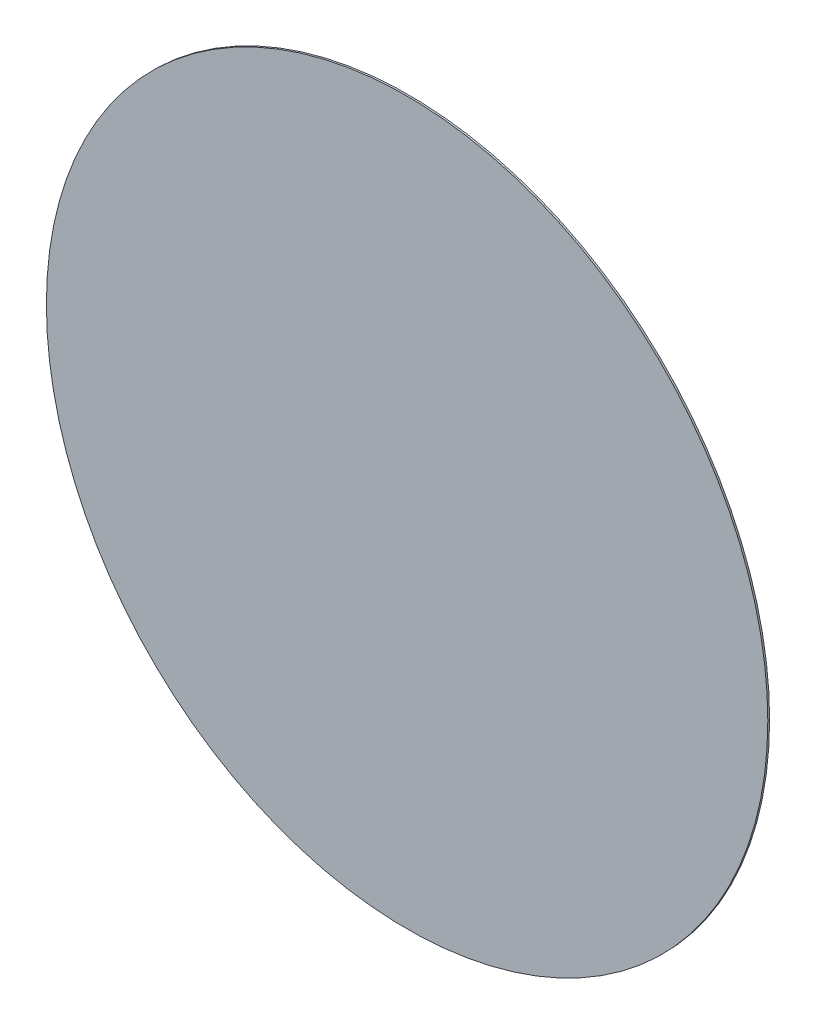
ISO-10303-21;
HEADER;
FILE_DESCRIPTION(('STEP AP214'),'2;1');
FILE_NAME('part.step','',(''),(''),'','','');
FILE_SCHEMA(('AUTOMOTIVE_DESIGN { 1 0 10303 214 1 1 1 1 }'));
ENDSEC;
DATA;
#1=APPLICATION_CONTEXT('core data for automotive mechanical design processes');
#2=APPLICATION_PROTOCOL_DEFINITION('international standard','automotive_design',2000,#1);
#3=PRODUCT_CONTEXT('',#1,'mechanical');
#4=PRODUCT('Part','Part','',(#3));
#5=PRODUCT_RELATED_PRODUCT_CATEGORY('part','',(#4));
#6=PRODUCT_DEFINITION_FORMATION('','',#4);
#7=PRODUCT_DEFINITION_CONTEXT('part definition',#1,'design');
#8=PRODUCT_DEFINITION('design','',#6,#7);
#9=PRODUCT_DEFINITION_SHAPE('','',#8);
#10=(LENGTH_UNIT() NAMED_UNIT(*) SI_UNIT(.MILLI.,.METRE.));
#11=(NAMED_UNIT(*) PLANE_ANGLE_UNIT() SI_UNIT($,.RADIAN.));
#12=(NAMED_UNIT(*) SI_UNIT($,.STERADIAN.) SOLID_ANGLE_UNIT());
#13=UNCERTAINTY_MEASURE_WITH_UNIT(LENGTH_MEASURE(1.E-05),#10,'distance_accuracy_value','');
#14=(GEOMETRIC_REPRESENTATION_CONTEXT(3) GLOBAL_UNCERTAINTY_ASSIGNED_CONTEXT((#13)) GLOBAL_UNIT_ASSIGNED_CONTEXT((#10,
#11,#12)) REPRESENTATION_CONTEXT('',''));
#15=CARTESIAN_POINT('',(0.,0.,0.));
#16=DIRECTION('',(0.,0.,1.));
#17=DIRECTION('',(1.,0.,0.));
#18=AXIS2_PLACEMENT_3D('',#15,#16,#17);
#19=CARTESIAN_POINT('',(0.,0.,0.));
#20=DIRECTION('',(0.,0.,1.));
#21=DIRECTION('',(-1.,0.,0.));
#22=AXIS2_PLACEMENT_3D('',#19,#20,#21);
#23=CYLINDRICAL_SURFACE('',#22,0.2);
#24=DIRECTION('',(0.,0.,1.));
#25=VECTOR('',#24,1.);
#26=CARTESIAN_POINT('',(0.2,0.,0.));
#27=LINE('',#26,#25);
#28=CARTESIAN_POINT('',(0.2,0.,0.));
#29=VERTEX_POINT('',#28);
#30=CARTESIAN_POINT('',(0.2,0.,0.001));
#31=VERTEX_POINT('',#30);
#32=EDGE_CURVE('E54',#29,#31,#27,.T.);
#33=ORIENTED_EDGE('',*,*,#32,.F.);
#34=CARTESIAN_POINT('',(0.,0.,0.));
#35=DIRECTION('',(0.,0.,-1.));
#36=DIRECTION('',(-1.,0.,0.));
#37=AXIS2_PLACEMENT_3D('',#34,#35,#36);
#38=CIRCLE('',#37,0.2);
#39=CARTESIAN_POINT('',(-0.2,0.,0.));
#40=VERTEX_POINT('',#39);
#41=EDGE_CURVE('E11',#40,#29,#38,.T.);
#42=ORIENTED_EDGE('',*,*,#41,.F.);
#43=DIRECTION('',(0.,0.,1.));
#44=VECTOR('',#43,1.);
#45=CARTESIAN_POINT('',(-0.2,0.,0.));
#46=LINE('',#45,#44);
#47=CARTESIAN_POINT('',(-0.2,0.,0.001));
#48=VERTEX_POINT('',#47);
#49=EDGE_CURVE('E51',#40,#48,#46,.T.);
#50=ORIENTED_EDGE('',*,*,#49,.T.);
#51=CARTESIAN_POINT('',(0.,0.,0.001));
#52=DIRECTION('',(0.,0.,1.));
#53=DIRECTION('',(-1.,0.,0.));
#54=AXIS2_PLACEMENT_3D('',#51,#52,#53);
#55=CIRCLE('',#54,0.2);
#56=EDGE_CURVE('E27',#31,#48,#55,.T.);
#57=ORIENTED_EDGE('',*,*,#56,.F.);
#58=EDGE_LOOP('',(#33,#42,#50,#57));
#59=FACE_BOUND('',#58,.T.);
#60=ADVANCED_FACE('F16',(#59),#23,.T.);
#61=CARTESIAN_POINT('',(0.,0.,0.));
#62=DIRECTION('',(0.,0.,1.));
#63=DIRECTION('',(1.,0.,0.));
#64=AXIS2_PLACEMENT_3D('',#61,#62,#63);
#65=PLANE('',#64);
#66=ORIENTED_EDGE('',*,*,#41,.T.);
#67=CARTESIAN_POINT('',(0.,0.,0.));
#68=DIRECTION('',(0.,0.,-1.));
#69=DIRECTION('',(-1.,0.,0.));
#70=AXIS2_PLACEMENT_3D('',#67,#68,#69);
#71=CIRCLE('',#70,0.2);
#72=EDGE_CURVE('E60',#29,#40,#71,.T.);
#73=ORIENTED_EDGE('',*,*,#72,.T.);
#74=EDGE_LOOP('',(#66,#73));
#75=FACE_BOUND('',#74,.T.);
#76=ADVANCED_FACE('F18',(#75),#65,.F.);
#77=CARTESIAN_POINT('',(0.,0.,0.001));
#78=DIRECTION('',(0.,0.,1.));
#79=DIRECTION('',(1.,0.,0.));
#80=AXIS2_PLACEMENT_3D('',#77,#78,#79);
#81=PLANE('',#80);
#82=CARTESIAN_POINT('',(0.,0.,0.001));
#83=DIRECTION('',(0.,0.,1.));
#84=DIRECTION('',(-1.,0.,0.));
#85=AXIS2_PLACEMENT_3D('',#82,#83,#84);
#86=CIRCLE('',#85,0.2);
#87=EDGE_CURVE('E20',#48,#31,#86,.T.);
#88=ORIENTED_EDGE('',*,*,#87,.T.);
#89=ORIENTED_EDGE('',*,*,#56,.T.);
#90=EDGE_LOOP('',(#88,#89));
#91=FACE_BOUND('',#90,.T.);
#92=ADVANCED_FACE('F119',(#91),#81,.T.);
#93=CARTESIAN_POINT('',(0.,0.,0.));
#94=DIRECTION('',(0.,0.,1.));
#95=DIRECTION('',(-1.,0.,0.));
#96=AXIS2_PLACEMENT_3D('',#93,#94,#95);
#97=CYLINDRICAL_SURFACE('',#96,0.2);
#98=ORIENTED_EDGE('',*,*,#72,.F.);
#99=ORIENTED_EDGE('',*,*,#32,.T.);
#100=ORIENTED_EDGE('',*,*,#87,.F.);
#101=ORIENTED_EDGE('',*,*,#49,.F.);
#102=EDGE_LOOP('',(#98,#99,#100,#101));
#103=FACE_BOUND('',#102,.T.);
#104=ADVANCED_FACE('F59',(#103),#97,.T.);
#105=CLOSED_SHELL('',(#60,#76,#92,#104));
#106=MANIFOLD_SOLID_BREP('B1',#105);
#107=ADVANCED_BREP_SHAPE_REPRESENTATION('',(#18,#106),#14);
#108=SHAPE_DEFINITION_REPRESENTATION(#9,#107);
ENDSEC;
END-ISO-10303-21;
